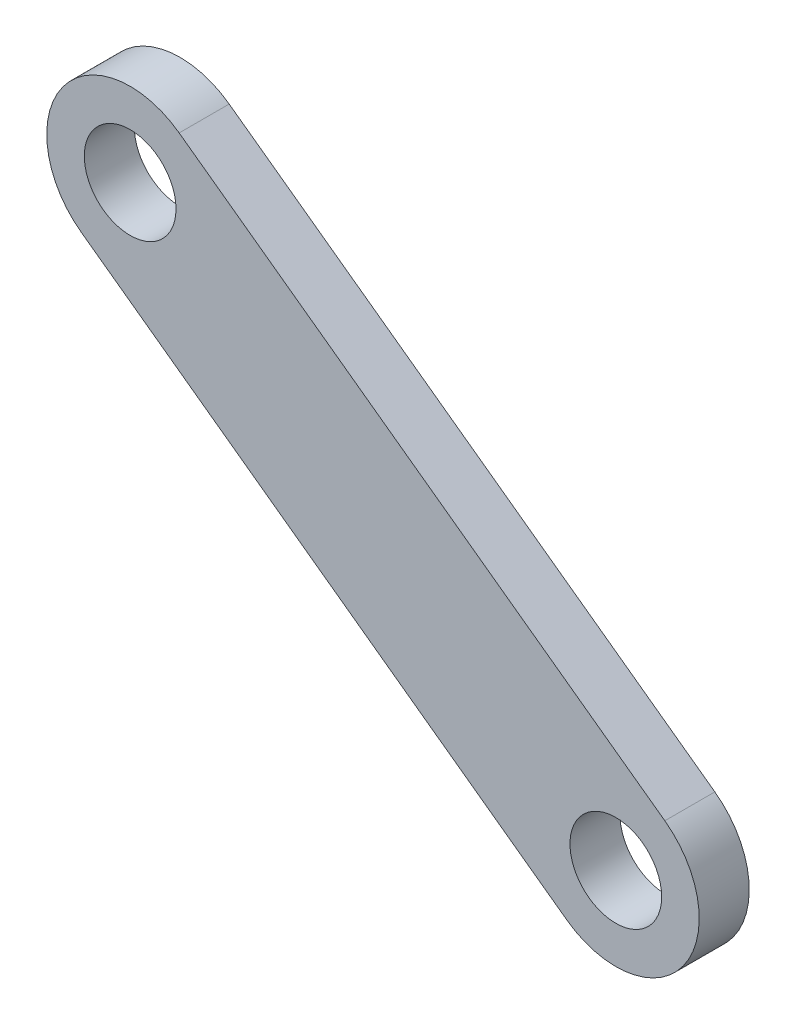
ISO-10303-21;
HEADER;
FILE_DESCRIPTION(('STEP AP214'),'2;1');
FILE_NAME('part.step','',(''),(''),'','','');
FILE_SCHEMA(('AUTOMOTIVE_DESIGN { 1 0 10303 214 1 1 1 1 }'));
ENDSEC;
DATA;
#1=APPLICATION_CONTEXT('core data for automotive mechanical design processes');
#2=APPLICATION_PROTOCOL_DEFINITION('international standard','automotive_design',2000,#1);
#3=PRODUCT_CONTEXT('',#1,'mechanical');
#4=PRODUCT('Part','Part','',(#3));
#5=PRODUCT_RELATED_PRODUCT_CATEGORY('part','',(#4));
#6=PRODUCT_DEFINITION_FORMATION('','',#4);
#7=PRODUCT_DEFINITION_CONTEXT('part definition',#1,'design');
#8=PRODUCT_DEFINITION('design','',#6,#7);
#9=PRODUCT_DEFINITION_SHAPE('','',#8);
#10=(LENGTH_UNIT() NAMED_UNIT(*) SI_UNIT(.MILLI.,.METRE.));
#11=(NAMED_UNIT(*) PLANE_ANGLE_UNIT() SI_UNIT($,.RADIAN.));
#12=(NAMED_UNIT(*) SI_UNIT($,.STERADIAN.) SOLID_ANGLE_UNIT());
#13=UNCERTAINTY_MEASURE_WITH_UNIT(LENGTH_MEASURE(1.E-05),#10,'distance_accuracy_value','');
#14=(GEOMETRIC_REPRESENTATION_CONTEXT(3) GLOBAL_UNCERTAINTY_ASSIGNED_CONTEXT((#13)) GLOBAL_UNIT_ASSIGNED_CONTEXT((#10,
#11,#12)) REPRESENTATION_CONTEXT('',''));
#15=CARTESIAN_POINT('',(0.,0.,0.));
#16=DIRECTION('',(0.,0.,1.));
#17=DIRECTION('',(1.,0.,0.));
#18=AXIS2_PLACEMENT_3D('',#15,#16,#17);
#19=CARTESIAN_POINT('',(0.,0.,4.7625));
#20=DIRECTION('',(0.,0.,-1.));
#21=DIRECTION('',(-1.,0.,0.));
#22=AXIS2_PLACEMENT_3D('',#19,#20,#21);
#23=CYLINDRICAL_SURFACE('',#22,7.9375);
#24=CARTESIAN_POINT('',(0.,0.,0.));
#25=DIRECTION('',(0.,0.,1.));
#26=DIRECTION('',(1.,0.,0.));
#27=AXIS2_PLACEMENT_3D('',#24,#25,#26);
#28=CIRCLE('',#27,7.9375);
#29=CARTESIAN_POINT('',(4.66554544007151,6.42157239285114,0.));
#30=VERTEX_POINT('',#29);
#31=CARTESIAN_POINT('',(-4.66554544007151,-6.42157239285114,0.));
#32=VERTEX_POINT('',#31);
#33=EDGE_CURVE('E99',#30,#32,#28,.T.);
#34=ORIENTED_EDGE('',*,*,#33,.T.);
#35=DIRECTION('',(0.,0.,-1.));
#36=VECTOR('',#35,1.);
#37=CARTESIAN_POINT('',(-4.66554544007151,-6.42157239285114,4.7625));
#38=LINE('',#37,#36);
#39=CARTESIAN_POINT('',(-4.66554544007151,-6.42157239285114,4.7625));
#40=VERTEX_POINT('',#39);
#41=EDGE_CURVE('E11',#40,#32,#38,.T.);
#42=ORIENTED_EDGE('',*,*,#41,.F.);
#43=CARTESIAN_POINT('',(0.,0.,4.7625));
#44=DIRECTION('',(0.,0.,1.));
#45=DIRECTION('',(1.,0.,0.));
#46=AXIS2_PLACEMENT_3D('',#43,#44,#45);
#47=CIRCLE('',#46,7.9375);
#48=CARTESIAN_POINT('',(4.66554544007151,6.42157239285114,4.7625));
#49=VERTEX_POINT('',#48);
#50=EDGE_CURVE('E87',#49,#40,#47,.T.);
#51=ORIENTED_EDGE('',*,*,#50,.F.);
#52=DIRECTION('',(0.,0.,-1.));
#53=VECTOR('',#52,1.);
#54=CARTESIAN_POINT('',(4.66554544007151,6.42157239285114,4.7625));
#55=LINE('',#54,#53);
#56=EDGE_CURVE('E95',#49,#30,#55,.T.);
#57=ORIENTED_EDGE('',*,*,#56,.T.);
#58=EDGE_LOOP('',(#34,#42,#51,#57));
#59=FACE_BOUND('',#58,.T.);
#60=ADVANCED_FACE('F36',(#59),#23,.T.);
#61=CARTESIAN_POINT('',(-4.66554544007151,-6.42157239285114,4.7625));
#62=DIRECTION('',(0.587785252292474,0.809016994374947,0.));
#63=DIRECTION('',(-0.809016994374947,0.587785252292474,0.));
#64=AXIS2_PLACEMENT_3D('',#61,#62,#63);
#65=PLANE('',#64);
#66=DIRECTION('',(0.809016994374947,-0.587785252292474,0.));
#67=VECTOR('',#66,1.);
#68=CARTESIAN_POINT('',(-4.66554544007151,-6.42157239285114,0.));
#69=LINE('',#68,#67);
#70=CARTESIAN_POINT('',(41.5697757884567,-40.013499561366,0.));
#71=VERTEX_POINT('',#70);
#72=EDGE_CURVE('E91',#32,#71,#69,.T.);
#73=ORIENTED_EDGE('',*,*,#72,.T.);
#74=DIRECTION('',(0.,0.,-1.));
#75=VECTOR('',#74,1.);
#76=CARTESIAN_POINT('',(41.5697757884567,-40.013499561366,4.7625));
#77=LINE('',#76,#75);
#78=CARTESIAN_POINT('',(41.5697757884567,-40.013499561366,4.7625));
#79=VERTEX_POINT('',#78);
#80=EDGE_CURVE('E44',#79,#71,#77,.T.);
#81=ORIENTED_EDGE('',*,*,#80,.F.);
#82=DIRECTION('',(0.809016994374947,-0.587785252292474,0.));
#83=VECTOR('',#82,1.);
#84=CARTESIAN_POINT('',(-4.66554544007151,-6.42157239285114,4.7625));
#85=LINE('',#84,#83);
#86=EDGE_CURVE('E82',#40,#79,#85,.T.);
#87=ORIENTED_EDGE('',*,*,#86,.F.);
#88=ORIENTED_EDGE('',*,*,#41,.T.);
#89=EDGE_LOOP('',(#73,#81,#87,#88));
#90=FACE_BOUND('',#89,.T.);
#91=ADVANCED_FACE('F90',(#90),#65,.F.);
#92=CARTESIAN_POINT('',(46.2353212285282,-33.5919271685149,4.7625));
#93=DIRECTION('',(0.,0.,-1.));
#94=DIRECTION('',(-1.,0.,0.));
#95=AXIS2_PLACEMENT_3D('',#92,#93,#94);
#96=CYLINDRICAL_SURFACE('',#95,7.93749999999999);
#97=CARTESIAN_POINT('',(46.2353212285282,-33.5919271685149,0.));
#98=DIRECTION('',(0.,0.,1.));
#99=DIRECTION('',(1.,0.,0.));
#100=AXIS2_PLACEMENT_3D('',#97,#98,#99);
#101=CIRCLE('',#100,7.93749999999999);
#102=CARTESIAN_POINT('',(50.9008666685997,-27.1703547756638,0.));
#103=VERTEX_POINT('',#102);
#104=EDGE_CURVE('E69',#71,#103,#101,.T.);
#105=ORIENTED_EDGE('',*,*,#104,.T.);
#106=DIRECTION('',(0.,0.,-1.));
#107=VECTOR('',#106,1.);
#108=CARTESIAN_POINT('',(50.9008666685997,-27.1703547756638,4.7625));
#109=LINE('',#108,#107);
#110=CARTESIAN_POINT('',(50.9008666685997,-27.1703547756638,4.7625));
#111=VERTEX_POINT('',#110);
#112=EDGE_CURVE('E92',#111,#103,#109,.T.);
#113=ORIENTED_EDGE('',*,*,#112,.F.);
#114=CARTESIAN_POINT('',(46.2353212285282,-33.5919271685149,4.7625));
#115=DIRECTION('',(0.,0.,1.));
#116=DIRECTION('',(1.,0.,0.));
#117=AXIS2_PLACEMENT_3D('',#114,#115,#116);
#118=CIRCLE('',#117,7.93749999999999);
#119=EDGE_CURVE('E85',#79,#111,#118,.T.);
#120=ORIENTED_EDGE('',*,*,#119,.F.);
#121=ORIENTED_EDGE('',*,*,#80,.T.);
#122=EDGE_LOOP('',(#105,#113,#120,#121));
#123=FACE_BOUND('',#122,.T.);
#124=ADVANCED_FACE('F93',(#123),#96,.T.);
#125=CARTESIAN_POINT('',(4.66554544007151,6.42157239285114,4.7625));
#126=DIRECTION('',(-0.587785252292474,-0.809016994374947,0.));
#127=DIRECTION('',(0.809016994374947,-0.587785252292474,0.));
#128=AXIS2_PLACEMENT_3D('',#125,#126,#127);
#129=PLANE('',#128);
#130=DIRECTION('',(-0.809016994374947,0.587785252292474,0.));
#131=VECTOR('',#130,1.);
#132=CARTESIAN_POINT('',(4.66554544007151,6.42157239285114,0.));
#133=LINE('',#132,#131);
#134=EDGE_CURVE('E75',#103,#30,#133,.T.);
#135=ORIENTED_EDGE('',*,*,#134,.T.);
#136=ORIENTED_EDGE('',*,*,#56,.F.);
#137=DIRECTION('',(-0.809016994374947,0.587785252292474,0.));
#138=VECTOR('',#137,1.);
#139=CARTESIAN_POINT('',(4.66554544007151,6.42157239285114,4.7625));
#140=LINE('',#139,#138);
#141=EDGE_CURVE('E52',#111,#49,#140,.T.);
#142=ORIENTED_EDGE('',*,*,#141,.F.);
#143=ORIENTED_EDGE('',*,*,#112,.T.);
#144=EDGE_LOOP('',(#135,#136,#142,#143));
#145=FACE_BOUND('',#144,.T.);
#146=ADVANCED_FACE('F107',(#145),#129,.F.);
#147=CARTESIAN_POINT('',(0.,0.,4.7625));
#148=DIRECTION('',(0.,0.,1.));
#149=DIRECTION('',(1.,0.,0.));
#150=AXIS2_PLACEMENT_3D('',#147,#148,#149);
#151=PLANE('',#150);
#152=CARTESIAN_POINT('',(0.,0.,4.7625));
#153=DIRECTION('',(0.,0.,1.));
#154=DIRECTION('',(1.,0.,0.));
#155=AXIS2_PLACEMENT_3D('',#152,#153,#154);
#156=CIRCLE('',#155,4.36498999999999);
#157=CARTESIAN_POINT('',(4.36498999999999,0.,4.7625));
#158=VERTEX_POINT('',#157);
#159=EDGE_CURVE('E121',#158,#158,#156,.T.);
#160=ORIENTED_EDGE('',*,*,#159,.F.);
#161=EDGE_LOOP('',(#160));
#162=FACE_BOUND('',#161,.T.);
#163=CARTESIAN_POINT('',(46.2353212285282,-33.5919271685149,4.7625));
#164=DIRECTION('',(0.,0.,1.));
#165=DIRECTION('',(1.,0.,0.));
#166=AXIS2_PLACEMENT_3D('',#163,#164,#165);
#167=CIRCLE('',#166,4.36498999999999);
#168=CARTESIAN_POINT('',(50.6003112285282,-33.5919271685149,4.7625));
#169=VERTEX_POINT('',#168);
#170=EDGE_CURVE('E115',#169,#169,#167,.T.);
#171=ORIENTED_EDGE('',*,*,#170,.F.);
#172=EDGE_LOOP('',(#171));
#173=FACE_BOUND('',#172,.T.);
#174=ORIENTED_EDGE('',*,*,#50,.T.);
#175=ORIENTED_EDGE('',*,*,#86,.T.);
#176=ORIENTED_EDGE('',*,*,#119,.T.);
#177=ORIENTED_EDGE('',*,*,#141,.T.);
#178=EDGE_LOOP('',(#174,#175,#176,#177));
#179=FACE_BOUND('',#178,.T.);
#180=ADVANCED_FACE('F83',(#162,#173,#179),#151,.T.);
#181=CARTESIAN_POINT('',(0.,0.,0.));
#182=DIRECTION('',(0.,0.,1.));
#183=DIRECTION('',(1.,0.,0.));
#184=AXIS2_PLACEMENT_3D('',#181,#182,#183);
#185=PLANE('',#184);
#186=CARTESIAN_POINT('',(0.,0.,0.));
#187=DIRECTION('',(0.,0.,1.));
#188=DIRECTION('',(1.,0.,0.));
#189=AXIS2_PLACEMENT_3D('',#186,#187,#188);
#190=CIRCLE('',#189,4.36499);
#191=CARTESIAN_POINT('',(4.36499,0.,0.));
#192=VERTEX_POINT('',#191);
#193=EDGE_CURVE('E118',#192,#192,#190,.T.);
#194=ORIENTED_EDGE('',*,*,#193,.T.);
#195=EDGE_LOOP('',(#194));
#196=FACE_BOUND('',#195,.T.);
#197=CARTESIAN_POINT('',(46.2353212285282,-33.5919271685149,0.));
#198=DIRECTION('',(0.,0.,1.));
#199=DIRECTION('',(1.,0.,0.));
#200=AXIS2_PLACEMENT_3D('',#197,#198,#199);
#201=CIRCLE('',#200,4.36498999999999);
#202=CARTESIAN_POINT('',(50.6003112285282,-33.5919271685149,0.));
#203=VERTEX_POINT('',#202);
#204=EDGE_CURVE('E102',#203,#203,#201,.T.);
#205=ORIENTED_EDGE('',*,*,#204,.T.);
#206=EDGE_LOOP('',(#205));
#207=FACE_BOUND('',#206,.T.);
#208=ORIENTED_EDGE('',*,*,#33,.F.);
#209=ORIENTED_EDGE('',*,*,#134,.F.);
#210=ORIENTED_EDGE('',*,*,#104,.F.);
#211=ORIENTED_EDGE('',*,*,#72,.F.);
#212=EDGE_LOOP('',(#208,#209,#210,#211));
#213=FACE_BOUND('',#212,.T.);
#214=ADVANCED_FACE('F110',(#196,#207,#213),#185,.F.);
#215=CARTESIAN_POINT('',(46.2353212285282,-33.5919271685149,4.7625));
#216=DIRECTION('',(0.,0.,1.));
#217=DIRECTION('',(1.,0.,0.));
#218=AXIS2_PLACEMENT_3D('',#215,#216,#217);
#219=CYLINDRICAL_SURFACE('',#218,4.36498999999999);
#220=ORIENTED_EDGE('',*,*,#204,.F.);
#221=EDGE_LOOP('',(#220));
#222=FACE_BOUND('',#221,.T.);
#223=ORIENTED_EDGE('',*,*,#170,.T.);
#224=EDGE_LOOP('',(#223));
#225=FACE_BOUND('',#224,.T.);
#226=ADVANCED_FACE('F132',(#222,#225),#219,.F.);
#227=CARTESIAN_POINT('',(0.,0.,4.7625));
#228=DIRECTION('',(0.,0.,1.));
#229=DIRECTION('',(1.,0.,0.));
#230=AXIS2_PLACEMENT_3D('',#227,#228,#229);
#231=CYLINDRICAL_SURFACE('',#230,4.36498999999999);
#232=ORIENTED_EDGE('',*,*,#193,.F.);
#233=EDGE_LOOP('',(#232));
#234=FACE_BOUND('',#233,.T.);
#235=ORIENTED_EDGE('',*,*,#159,.T.);
#236=EDGE_LOOP('',(#235));
#237=FACE_BOUND('',#236,.T.);
#238=ADVANCED_FACE('F125',(#234,#237),#231,.F.);
#239=CLOSED_SHELL('',(#60,#91,#124,#146,#180,#214,#226,#238));
#240=MANIFOLD_SOLID_BREP('B2',#239);
#241=ADVANCED_BREP_SHAPE_REPRESENTATION('',(#18,#240),#14);
#242=SHAPE_DEFINITION_REPRESENTATION(#9,#241);
ENDSEC;
END-ISO-10303-21;
